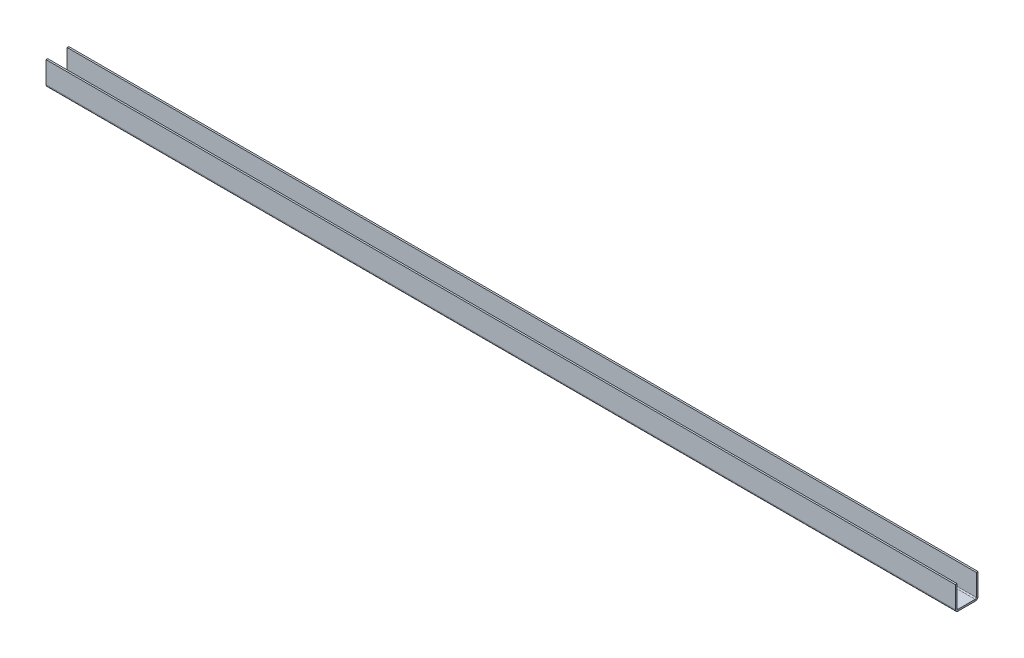
ISO-10303-21;
HEADER;
FILE_DESCRIPTION(('STEP AP214'),'2;1');
FILE_NAME('part.step','',(''),(''),'','','');
FILE_SCHEMA(('AUTOMOTIVE_DESIGN { 1 0 10303 214 1 1 1 1 }'));
ENDSEC;
DATA;
#1=APPLICATION_CONTEXT('core data for automotive mechanical design processes');
#2=APPLICATION_PROTOCOL_DEFINITION('international standard','automotive_design',2000,#1);
#3=PRODUCT_CONTEXT('',#1,'mechanical');
#4=PRODUCT('Part','Part','',(#3));
#5=PRODUCT_RELATED_PRODUCT_CATEGORY('part','',(#4));
#6=PRODUCT_DEFINITION_FORMATION('','',#4);
#7=PRODUCT_DEFINITION_CONTEXT('part definition',#1,'design');
#8=PRODUCT_DEFINITION('design','',#6,#7);
#9=PRODUCT_DEFINITION_SHAPE('','',#8);
#10=(LENGTH_UNIT() NAMED_UNIT(*) SI_UNIT(.MILLI.,.METRE.));
#11=(NAMED_UNIT(*) PLANE_ANGLE_UNIT() SI_UNIT($,.RADIAN.));
#12=(NAMED_UNIT(*) SI_UNIT($,.STERADIAN.) SOLID_ANGLE_UNIT());
#13=UNCERTAINTY_MEASURE_WITH_UNIT(LENGTH_MEASURE(1.E-05),#10,'distance_accuracy_value','');
#14=(GEOMETRIC_REPRESENTATION_CONTEXT(3) GLOBAL_UNCERTAINTY_ASSIGNED_CONTEXT((#13)) GLOBAL_UNIT_ASSIGNED_CONTEXT((#10,
#11,#12)) REPRESENTATION_CONTEXT('',''));
#15=CARTESIAN_POINT('',(0.,0.,0.));
#16=DIRECTION('',(0.,0.,1.));
#17=DIRECTION('',(1.,0.,0.));
#18=AXIS2_PLACEMENT_3D('',#15,#16,#17);
#19=CARTESIAN_POINT('',(400.,-1.50000000000006,2331.95118638464));
#20=DIRECTION('',(0.,1.,0.));
#21=DIRECTION('',(0.,0.,1.));
#22=AXIS2_PLACEMENT_3D('',#19,#20,#21);
#23=PLANE('',#22);
#24=DIRECTION('',(0.,0.,-1.));
#25=VECTOR('',#24,1.);
#26=CARTESIAN_POINT('',(400.,-1.50000000000006,2331.95118638464));
#27=LINE('',#26,#25);
#28=CARTESIAN_POINT('',(400.,-1.50000000000006,731.5));
#29=VERTEX_POINT('',#28);
#30=CARTESIAN_POINT('',(400.,-1.50000000000006,730.));
#31=VERTEX_POINT('',#30);
#32=EDGE_CURVE('E590',#29,#31,#27,.T.);
#33=ORIENTED_EDGE('',*,*,#32,.T.);
#34=DIRECTION('',(1.,0.,0.));
#35=VECTOR('',#34,1.);
#36=CARTESIAN_POINT('',(400.,-1.50000000000006,730.));
#37=LINE('',#36,#35);
#38=CARTESIAN_POINT('',(-400.,-1.50000000000006,730.));
#39=VERTEX_POINT('',#38);
#40=EDGE_CURVE('E592',#31,#39,#37,.F.);
#41=ORIENTED_EDGE('',*,*,#40,.T.);
#42=DIRECTION('',(0.,0.,-1.));
#43=VECTOR('',#42,1.);
#44=CARTESIAN_POINT('',(-400.,-1.50000000000006,2331.95118638464));
#45=LINE('',#44,#43);
#46=CARTESIAN_POINT('',(-400.,-1.50000000000006,731.5));
#47=VERTEX_POINT('',#46);
#48=EDGE_CURVE('E753',#47,#39,#45,.T.);
#49=ORIENTED_EDGE('',*,*,#48,.F.);
#50=DIRECTION('',(-1.,0.,0.));
#51=VECTOR('',#50,1.);
#52=CARTESIAN_POINT('',(400.,-1.50000000000006,731.5));
#53=LINE('',#52,#51);
#54=EDGE_CURVE('E125',#47,#29,#53,.F.);
#55=ORIENTED_EDGE('',*,*,#54,.T.);
#56=EDGE_LOOP('',(#33,#41,#49,#55));
#57=FACE_BOUND('',#56,.T.);
#58=ADVANCED_FACE('F69',(#57),#23,.T.);
#59=CARTESIAN_POINT('',(400.,-1.50000000000006,2331.95118638464));
#60=DIRECTION('',(1.,0.,0.));
#61=DIRECTION('',(0.,0.,1.));
#62=AXIS2_PLACEMENT_3D('',#59,#60,#61);
#63=PLANE('',#62);
#64=DIRECTION('',(0.,0.,-1.));
#65=VECTOR('',#64,1.);
#66=CARTESIAN_POINT('',(400.,-20.5,2331.95118638464));
#67=LINE('',#66,#65);
#68=CARTESIAN_POINT('',(400.,-20.5,731.5));
#69=VERTEX_POINT('',#68);
#70=CARTESIAN_POINT('',(400.,-20.4999999999998,730.));
#71=VERTEX_POINT('',#70);
#72=EDGE_CURVE('E636',#69,#71,#67,.T.);
#73=ORIENTED_EDGE('',*,*,#72,.T.);
#74=DIRECTION('',(0.,1.,0.));
#75=VECTOR('',#74,1.);
#76=CARTESIAN_POINT('',(400.,-19.,730.));
#77=LINE('',#76,#75);
#78=EDGE_CURVE('E756',#31,#71,#77,.F.);
#79=ORIENTED_EDGE('',*,*,#78,.F.);
#80=ORIENTED_EDGE('',*,*,#32,.F.);
#81=DIRECTION('',(0.,1.,0.));
#82=VECTOR('',#81,1.);
#83=CARTESIAN_POINT('',(400.,-1.50000000000006,731.5));
#84=LINE('',#83,#82);
#85=EDGE_CURVE('E119',#29,#69,#84,.F.);
#86=ORIENTED_EDGE('',*,*,#85,.T.);
#87=EDGE_LOOP('',(#73,#79,#80,#86));
#88=FACE_BOUND('',#87,.T.);
#89=ADVANCED_FACE('F736',(#88),#63,.T.);
#90=CARTESIAN_POINT('',(400.,-1.50000000000006,730.));
#91=DIRECTION('',(0.,0.,-1.));
#92=DIRECTION('',(-1.,0.,0.));
#93=AXIS2_PLACEMENT_3D('',#90,#91,#92);
#94=PLANE('',#93);
#95=ORIENTED_EDGE('',*,*,#78,.T.);
#96=DIRECTION('',(-1.,0.,0.));
#97=VECTOR('',#96,1.);
#98=CARTESIAN_POINT('',(400.,-20.5,730.));
#99=LINE('',#98,#97);
#100=CARTESIAN_POINT('',(-400.,-20.5000000000001,730.));
#101=VERTEX_POINT('',#100);
#102=EDGE_CURVE('E593',#101,#71,#99,.F.);
#103=ORIENTED_EDGE('',*,*,#102,.F.);
#104=DIRECTION('',(0.,1.,0.));
#105=VECTOR('',#104,1.);
#106=CARTESIAN_POINT('',(-400.,-20.,730.));
#107=LINE('',#106,#105);
#108=EDGE_CURVE('E388',#39,#101,#107,.F.);
#109=ORIENTED_EDGE('',*,*,#108,.F.);
#110=ORIENTED_EDGE('',*,*,#40,.F.);
#111=EDGE_LOOP('',(#95,#103,#109,#110));
#112=FACE_BOUND('',#111,.T.);
#113=ADVANCED_FACE('F741',(#112),#94,.T.);
#114=CARTESIAN_POINT('',(-400.,-1.50000000000006,2331.95118638464));
#115=DIRECTION('',(-1.,0.,0.));
#116=DIRECTION('',(0.,0.,-1.));
#117=AXIS2_PLACEMENT_3D('',#114,#115,#116);
#118=PLANE('',#117);
#119=ORIENTED_EDGE('',*,*,#48,.T.);
#120=ORIENTED_EDGE('',*,*,#108,.T.);
#121=DIRECTION('',(0.,0.,-1.));
#122=VECTOR('',#121,1.);
#123=CARTESIAN_POINT('',(-400.,-20.5,2331.95118638464));
#124=LINE('',#123,#122);
#125=CARTESIAN_POINT('',(-400.,-20.5,731.5));
#126=VERTEX_POINT('',#125);
#127=EDGE_CURVE('E74',#126,#101,#124,.T.);
#128=ORIENTED_EDGE('',*,*,#127,.F.);
#129=DIRECTION('',(0.,1.,0.));
#130=VECTOR('',#129,1.);
#131=CARTESIAN_POINT('',(-400.,-1.50000000000006,731.5));
#132=LINE('',#131,#130);
#133=EDGE_CURVE('E81',#126,#47,#132,.T.);
#134=ORIENTED_EDGE('',*,*,#133,.T.);
#135=EDGE_LOOP('',(#119,#120,#128,#134));
#136=FACE_BOUND('',#135,.T.);
#137=ADVANCED_FACE('F746',(#136),#118,.T.);
#138=CARTESIAN_POINT('',(400.,-1.50000000000006,731.5));
#139=DIRECTION('',(0.,0.,-1.));
#140=DIRECTION('',(-1.,0.,0.));
#141=AXIS2_PLACEMENT_3D('',#138,#139,#140);
#142=PLANE('',#141);
#143=DIRECTION('',(-1.,0.,0.));
#144=VECTOR('',#143,1.);
#145=CARTESIAN_POINT('',(400.,-20.5,731.5));
#146=LINE('',#145,#144);
#147=EDGE_CURVE('E13',#126,#69,#146,.F.);
#148=ORIENTED_EDGE('',*,*,#147,.T.);
#149=ORIENTED_EDGE('',*,*,#85,.F.);
#150=ORIENTED_EDGE('',*,*,#54,.F.);
#151=ORIENTED_EDGE('',*,*,#133,.F.);
#152=EDGE_LOOP('',(#148,#149,#150,#151));
#153=FACE_BOUND('',#152,.T.);
#154=ADVANCED_FACE('F72',(#153),#142,.F.);
#155=CARTESIAN_POINT('',(400.,-22.9999999999999,730.));
#156=DIRECTION('',(0.,-1.,0.));
#157=DIRECTION('',(0.,0.,-1.));
#158=AXIS2_PLACEMENT_3D('',#155,#156,#157);
#159=PLANE('',#158);
#160=DIRECTION('',(1.,0.,0.));
#161=VECTOR('',#160,1.);
#162=CARTESIAN_POINT('',(400.,-22.9999999999999,735.));
#163=LINE('',#162,#161);
#164=CARTESIAN_POINT('',(-2.7,-22.9999999999999,735.));
#165=VERTEX_POINT('',#164);
#166=CARTESIAN_POINT('',(2.7,-22.9999999999999,735.));
#167=VERTEX_POINT('',#166);
#168=EDGE_CURVE('E329',#165,#167,#163,.T.);
#169=ORIENTED_EDGE('',*,*,#168,.T.);
#170=DIRECTION('',(0.,0.,-1.));
#171=VECTOR('',#170,1.);
#172=CARTESIAN_POINT('',(2.69999999999998,-22.9999999999999,730.));
#173=LINE('',#172,#171);
#174=CARTESIAN_POINT('',(2.69999999999992,-22.9999999999998,732.5));
#175=VERTEX_POINT('',#174);
#176=EDGE_CURVE('E313',#167,#175,#173,.T.);
#177=ORIENTED_EDGE('',*,*,#176,.T.);
#178=DIRECTION('',(1.,0.,0.));
#179=VECTOR('',#178,1.);
#180=CARTESIAN_POINT('',(400.,-22.9999999999999,732.5));
#181=LINE('',#180,#179);
#182=CARTESIAN_POINT('',(400.,-22.9999999999999,732.5));
#183=VERTEX_POINT('',#182);
#184=EDGE_CURVE('E297',#175,#183,#181,.T.);
#185=ORIENTED_EDGE('',*,*,#184,.T.);
#186=DIRECTION('',(0.,0.,-1.));
#187=VECTOR('',#186,1.);
#188=CARTESIAN_POINT('',(400.,-22.9999999999999,731.5));
#189=LINE('',#188,#187);
#190=CARTESIAN_POINT('',(400.,-22.9999999999999,747.5));
#191=VERTEX_POINT('',#190);
#192=EDGE_CURVE('E312',#191,#183,#189,.T.);
#193=ORIENTED_EDGE('',*,*,#192,.F.);
#194=DIRECTION('',(-1.,0.,0.));
#195=VECTOR('',#194,1.);
#196=CARTESIAN_POINT('',(400.,-22.9999999999999,747.5));
#197=LINE('',#196,#195);
#198=CARTESIAN_POINT('',(2.69999999999998,-22.9999999999999,747.5));
#199=VERTEX_POINT('',#198);
#200=EDGE_CURVE('E588',#199,#191,#197,.F.);
#201=ORIENTED_EDGE('',*,*,#200,.F.);
#202=DIRECTION('',(0.,0.,-1.));
#203=VECTOR('',#202,1.);
#204=CARTESIAN_POINT('',(2.69999999999998,-22.9999999999999,730.));
#205=LINE('',#204,#203);
#206=CARTESIAN_POINT('',(2.7,-22.9999999999999,745.));
#207=VERTEX_POINT('',#206);
#208=EDGE_CURVE('E649',#199,#207,#205,.T.);
#209=ORIENTED_EDGE('',*,*,#208,.T.);
#210=DIRECTION('',(-1.,0.,0.));
#211=VECTOR('',#210,1.);
#212=CARTESIAN_POINT('',(400.,-22.9999999999999,745.));
#213=LINE('',#212,#211);
#214=CARTESIAN_POINT('',(-2.7,-22.9999999999999,745.));
#215=VERTEX_POINT('',#214);
#216=EDGE_CURVE('E652',#207,#215,#213,.T.);
#217=ORIENTED_EDGE('',*,*,#216,.T.);
#218=DIRECTION('',(0.,0.,1.));
#219=VECTOR('',#218,1.);
#220=CARTESIAN_POINT('',(-2.69999999999998,-22.9999999999999,730.));
#221=LINE('',#220,#219);
#222=CARTESIAN_POINT('',(-2.69999999999992,-22.9999999999999,747.5));
#223=VERTEX_POINT('',#222);
#224=EDGE_CURVE('E657',#215,#223,#221,.T.);
#225=ORIENTED_EDGE('',*,*,#224,.T.);
#226=CARTESIAN_POINT('',(-400.,-22.9999999999999,747.5));
#227=VERTEX_POINT('',#226);
#228=EDGE_CURVE('E650',#227,#223,#197,.F.);
#229=ORIENTED_EDGE('',*,*,#228,.F.);
#230=DIRECTION('',(0.,0.,1.));
#231=VECTOR('',#230,1.);
#232=CARTESIAN_POINT('',(-400.,-22.9999999999999,748.5));
#233=LINE('',#232,#231);
#234=CARTESIAN_POINT('',(-400.,-22.9999999999999,732.5));
#235=VERTEX_POINT('',#234);
#236=EDGE_CURVE('E656',#235,#227,#233,.T.);
#237=ORIENTED_EDGE('',*,*,#236,.F.);
#238=CARTESIAN_POINT('',(-2.69999999999992,-22.9999999999998,732.5));
#239=VERTEX_POINT('',#238);
#240=EDGE_CURVE('E315',#235,#239,#181,.T.);
#241=ORIENTED_EDGE('',*,*,#240,.T.);
#242=DIRECTION('',(0.,0.,1.));
#243=VECTOR('',#242,1.);
#244=CARTESIAN_POINT('',(-2.69999999999998,-22.9999999999999,730.));
#245=LINE('',#244,#243);
#246=EDGE_CURVE('E680',#239,#165,#245,.T.);
#247=ORIENTED_EDGE('',*,*,#246,.T.);
#248=EDGE_LOOP('',(#169,#177,#185,#193,#201,#209,#217,#225,#229,#237,#241,#247));
#249=FACE_BOUND('',#248,.T.);
#250=ADVANCED_FACE('F327',(#249),#159,.T.);
#251=CARTESIAN_POINT('',(2.69999999999998,1578.78122528511,730.));
#252=DIRECTION('',(-1.,0.,0.));
#253=DIRECTION('',(0.,-1.,0.));
#254=AXIS2_PLACEMENT_3D('',#251,#252,#253);
#255=PLANE('',#254);
#256=DIRECTION('',(0.,-1.,0.));
#257=VECTOR('',#256,1.);
#258=CARTESIAN_POINT('',(2.69999999999998,1578.78122528511,732.5));
#259=LINE('',#258,#257);
#260=CARTESIAN_POINT('',(2.69999999999992,-21.4999999999999,732.5));
#261=VERTEX_POINT('',#260);
#262=EDGE_CURVE('E320',#261,#175,#259,.T.);
#263=ORIENTED_EDGE('',*,*,#262,.T.);
#264=ORIENTED_EDGE('',*,*,#176,.F.);
#265=DIRECTION('',(0.,-1.,0.));
#266=VECTOR('',#265,1.);
#267=CARTESIAN_POINT('',(2.7,1578.78122528511,735.));
#268=LINE('',#267,#266);
#269=CARTESIAN_POINT('',(2.7,-21.4999999999999,735.));
#270=VERTEX_POINT('',#269);
#271=EDGE_CURVE('E382',#270,#167,#268,.T.);
#272=ORIENTED_EDGE('',*,*,#271,.F.);
#273=DIRECTION('',(0.,0.,-1.));
#274=VECTOR('',#273,1.);
#275=CARTESIAN_POINT('',(2.69999999999998,-21.5,730.));
#276=LINE('',#275,#274);
#277=EDGE_CURVE('E336',#270,#261,#276,.T.);
#278=ORIENTED_EDGE('',*,*,#277,.T.);
#279=EDGE_LOOP('',(#263,#264,#272,#278));
#280=FACE_BOUND('',#279,.T.);
#281=ADVANCED_FACE('F334',(#280),#255,.T.);
#282=CARTESIAN_POINT('',(400.,1578.78122528511,735.));
#283=DIRECTION('',(0.,0.,-1.));
#284=DIRECTION('',(0.,1.,0.));
#285=AXIS2_PLACEMENT_3D('',#282,#283,#284);
#286=PLANE('',#285);
#287=ORIENTED_EDGE('',*,*,#271,.T.);
#288=ORIENTED_EDGE('',*,*,#168,.F.);
#289=DIRECTION('',(0.,-1.,0.));
#290=VECTOR('',#289,1.);
#291=CARTESIAN_POINT('',(-2.7,1578.78122528511,735.));
#292=LINE('',#291,#290);
#293=CARTESIAN_POINT('',(-2.7,-21.4999999999999,735.));
#294=VERTEX_POINT('',#293);
#295=EDGE_CURVE('E379',#294,#165,#292,.T.);
#296=ORIENTED_EDGE('',*,*,#295,.F.);
#297=DIRECTION('',(1.,0.,0.));
#298=VECTOR('',#297,1.);
#299=CARTESIAN_POINT('',(400.,-21.5,735.));
#300=LINE('',#299,#298);
#301=EDGE_CURVE('E135',#294,#270,#300,.T.);
#302=ORIENTED_EDGE('',*,*,#301,.T.);
#303=EDGE_LOOP('',(#287,#288,#296,#302));
#304=FACE_BOUND('',#303,.T.);
#305=ADVANCED_FACE('F726',(#304),#286,.T.);
#306=CARTESIAN_POINT('',(-2.69999999999998,1578.78122528511,730.));
#307=DIRECTION('',(1.,0.,0.));
#308=DIRECTION('',(0.,1.,0.));
#309=AXIS2_PLACEMENT_3D('',#306,#307,#308);
#310=PLANE('',#309);
#311=ORIENTED_EDGE('',*,*,#295,.T.);
#312=ORIENTED_EDGE('',*,*,#246,.F.);
#313=DIRECTION('',(0.,-1.,0.));
#314=VECTOR('',#313,1.);
#315=CARTESIAN_POINT('',(-2.69999999999998,1578.78122528511,732.5));
#316=LINE('',#315,#314);
#317=CARTESIAN_POINT('',(-2.69999999999992,-21.4999999999999,732.5));
#318=VERTEX_POINT('',#317);
#319=EDGE_CURVE('E376',#318,#239,#316,.T.);
#320=ORIENTED_EDGE('',*,*,#319,.F.);
#321=DIRECTION('',(0.,0.,1.));
#322=VECTOR('',#321,1.);
#323=CARTESIAN_POINT('',(-2.69999999999998,-21.5,730.));
#324=LINE('',#323,#322);
#325=EDGE_CURVE('E144',#318,#294,#324,.T.);
#326=ORIENTED_EDGE('',*,*,#325,.T.);
#327=EDGE_LOOP('',(#311,#312,#320,#326));
#328=FACE_BOUND('',#327,.T.);
#329=ADVANCED_FACE('F725',(#328),#310,.T.);
#330=CARTESIAN_POINT('',(-400.,1578.78122528511,730.));
#331=DIRECTION('',(-1.,0.,0.));
#332=DIRECTION('',(0.,-1.,0.));
#333=AXIS2_PLACEMENT_3D('',#330,#331,#332);
#334=PLANE('',#333);
#335=DIRECTION('',(0.,-1.,0.));
#336=VECTOR('',#335,1.);
#337=CARTESIAN_POINT('',(-400.,1578.78122528511,732.5));
#338=LINE('',#337,#336);
#339=CARTESIAN_POINT('',(-400.,-21.4999999999999,732.5));
#340=VERTEX_POINT('',#339);
#341=EDGE_CURVE('E372',#340,#235,#338,.T.);
#342=ORIENTED_EDGE('',*,*,#341,.T.);
#343=ORIENTED_EDGE('',*,*,#236,.T.);
#344=DIRECTION('',(0.,-1.,0.));
#345=VECTOR('',#344,1.);
#346=CARTESIAN_POINT('',(-400.,1578.78122528511,747.5));
#347=LINE('',#346,#345);
#348=CARTESIAN_POINT('',(-400.,-21.5,747.5));
#349=VERTEX_POINT('',#348);
#350=EDGE_CURVE('E368',#349,#227,#347,.T.);
#351=ORIENTED_EDGE('',*,*,#350,.F.);
#352=DIRECTION('',(0.,0.,-1.));
#353=VECTOR('',#352,1.);
#354=CARTESIAN_POINT('',(-400.,-21.5,730.));
#355=LINE('',#354,#353);
#356=EDGE_CURVE('E448',#349,#340,#355,.T.);
#357=ORIENTED_EDGE('',*,*,#356,.T.);
#358=EDGE_LOOP('',(#342,#343,#351,#357));
#359=FACE_BOUND('',#358,.T.);
#360=ADVANCED_FACE('F714',(#359),#334,.T.);
#361=CARTESIAN_POINT('',(-2.69999999999998,1578.78122528511,730.));
#362=DIRECTION('',(1.,0.,0.));
#363=DIRECTION('',(0.,1.,0.));
#364=AXIS2_PLACEMENT_3D('',#361,#362,#363);
#365=PLANE('',#364);
#366=DIRECTION('',(0.,-1.,0.));
#367=VECTOR('',#366,1.);
#368=CARTESIAN_POINT('',(-2.69999999999998,1578.78122528511,747.5));
#369=LINE('',#368,#367);
#370=CARTESIAN_POINT('',(-2.69999999999998,-21.4999999999999,747.5));
#371=VERTEX_POINT('',#370);
#372=EDGE_CURVE('E365',#371,#223,#369,.T.);
#373=ORIENTED_EDGE('',*,*,#372,.T.);
#374=ORIENTED_EDGE('',*,*,#224,.F.);
#375=DIRECTION('',(0.,-1.,0.));
#376=VECTOR('',#375,1.);
#377=CARTESIAN_POINT('',(-2.7,1578.78122528511,745.));
#378=LINE('',#377,#376);
#379=CARTESIAN_POINT('',(-2.7,-21.4999999999999,745.));
#380=VERTEX_POINT('',#379);
#381=EDGE_CURVE('E361',#380,#215,#378,.T.);
#382=ORIENTED_EDGE('',*,*,#381,.F.);
#383=DIRECTION('',(0.,0.,1.));
#384=VECTOR('',#383,1.);
#385=CARTESIAN_POINT('',(-2.69999999999998,-21.5,730.));
#386=LINE('',#385,#384);
#387=EDGE_CURVE('E692',#380,#371,#386,.T.);
#388=ORIENTED_EDGE('',*,*,#387,.T.);
#389=EDGE_LOOP('',(#373,#374,#382,#388));
#390=FACE_BOUND('',#389,.T.);
#391=ADVANCED_FACE('F792',(#390),#365,.T.);
#392=CARTESIAN_POINT('',(400.,1578.78122528511,745.));
#393=DIRECTION('',(0.,0.,1.));
#394=DIRECTION('',(0.,-1.,0.));
#395=AXIS2_PLACEMENT_3D('',#392,#393,#394);
#396=PLANE('',#395);
#397=ORIENTED_EDGE('',*,*,#381,.T.);
#398=ORIENTED_EDGE('',*,*,#216,.F.);
#399=DIRECTION('',(0.,-1.,0.));
#400=VECTOR('',#399,1.);
#401=CARTESIAN_POINT('',(2.7,1578.78122528511,745.));
#402=LINE('',#401,#400);
#403=CARTESIAN_POINT('',(2.7,-21.4999999999999,745.));
#404=VERTEX_POINT('',#403);
#405=EDGE_CURVE('E357',#404,#207,#402,.T.);
#406=ORIENTED_EDGE('',*,*,#405,.F.);
#407=DIRECTION('',(-1.,0.,0.));
#408=VECTOR('',#407,1.);
#409=CARTESIAN_POINT('',(400.,-21.5,745.));
#410=LINE('',#409,#408);
#411=EDGE_CURVE('E695',#404,#380,#410,.T.);
#412=ORIENTED_EDGE('',*,*,#411,.T.);
#413=EDGE_LOOP('',(#397,#398,#406,#412));
#414=FACE_BOUND('',#413,.T.);
#415=ADVANCED_FACE('F789',(#414),#396,.T.);
#416=CARTESIAN_POINT('',(2.69999999999998,1578.78122528511,730.));
#417=DIRECTION('',(-1.,0.,0.));
#418=DIRECTION('',(0.,-1.,0.));
#419=AXIS2_PLACEMENT_3D('',#416,#417,#418);
#420=PLANE('',#419);
#421=ORIENTED_EDGE('',*,*,#405,.T.);
#422=ORIENTED_EDGE('',*,*,#208,.F.);
#423=DIRECTION('',(0.,-1.,0.));
#424=VECTOR('',#423,1.);
#425=CARTESIAN_POINT('',(2.69999999999998,1578.78122528511,747.5));
#426=LINE('',#425,#424);
#427=CARTESIAN_POINT('',(2.69999999999998,-21.5,747.5));
#428=VERTEX_POINT('',#427);
#429=EDGE_CURVE('E353',#428,#199,#426,.T.);
#430=ORIENTED_EDGE('',*,*,#429,.F.);
#431=DIRECTION('',(0.,0.,-1.));
#432=VECTOR('',#431,1.);
#433=CARTESIAN_POINT('',(2.69999999999998,-21.5,730.));
#434=LINE('',#433,#432);
#435=EDGE_CURVE('E699',#428,#404,#434,.T.);
#436=ORIENTED_EDGE('',*,*,#435,.T.);
#437=EDGE_LOOP('',(#421,#422,#430,#436));
#438=FACE_BOUND('',#437,.T.);
#439=ADVANCED_FACE('F786',(#438),#420,.T.);
#440=CARTESIAN_POINT('',(400.,1578.78122528511,730.));
#441=DIRECTION('',(1.,0.,0.));
#442=DIRECTION('',(0.,1.,0.));
#443=AXIS2_PLACEMENT_3D('',#440,#441,#442);
#444=PLANE('',#443);
#445=DIRECTION('',(0.,-1.,0.));
#446=VECTOR('',#445,1.);
#447=CARTESIAN_POINT('',(400.,1578.78122528511,747.5));
#448=LINE('',#447,#446);
#449=CARTESIAN_POINT('',(400.,-21.4999999999999,747.5));
#450=VERTEX_POINT('',#449);
#451=EDGE_CURVE('E344',#450,#191,#448,.T.);
#452=ORIENTED_EDGE('',*,*,#451,.T.);
#453=ORIENTED_EDGE('',*,*,#192,.T.);
#454=DIRECTION('',(0.,-1.,0.));
#455=VECTOR('',#454,1.);
#456=CARTESIAN_POINT('',(400.,1578.78122528511,732.5));
#457=LINE('',#456,#455);
#458=CARTESIAN_POINT('',(400.,-21.4999999999999,732.5));
#459=VERTEX_POINT('',#458);
#460=EDGE_CURVE('E339',#459,#183,#457,.T.);
#461=ORIENTED_EDGE('',*,*,#460,.F.);
#462=DIRECTION('',(0.,0.,-1.));
#463=VECTOR('',#462,1.);
#464=CARTESIAN_POINT('',(400.,-21.5,730.));
#465=LINE('',#464,#463);
#466=EDGE_CURVE('E346',#459,#450,#465,.F.);
#467=ORIENTED_EDGE('',*,*,#466,.T.);
#468=EDGE_LOOP('',(#452,#453,#461,#467));
#469=FACE_BOUND('',#468,.T.);
#470=ADVANCED_FACE('F646',(#469),#444,.T.);
#471=CARTESIAN_POINT('',(400.,-21.5,730.));
#472=DIRECTION('',(0.,-1.,0.));
#473=DIRECTION('',(0.,0.,-1.));
#474=AXIS2_PLACEMENT_3D('',#471,#472,#473);
#475=PLANE('',#474);
#476=ORIENTED_EDGE('',*,*,#277,.F.);
#477=ORIENTED_EDGE('',*,*,#301,.F.);
#478=ORIENTED_EDGE('',*,*,#325,.F.);
#479=DIRECTION('',(1.,0.,0.));
#480=VECTOR('',#479,1.);
#481=CARTESIAN_POINT('',(400.,-21.5,732.5));
#482=LINE('',#481,#480);
#483=EDGE_CURVE('E348',#340,#318,#482,.T.);
#484=ORIENTED_EDGE('',*,*,#483,.F.);
#485=ORIENTED_EDGE('',*,*,#356,.F.);
#486=DIRECTION('',(-1.,0.,0.));
#487=VECTOR('',#486,1.);
#488=CARTESIAN_POINT('',(400.,-21.5,747.5));
#489=LINE('',#488,#487);
#490=EDGE_CURVE('E696',#349,#371,#489,.F.);
#491=ORIENTED_EDGE('',*,*,#490,.T.);
#492=ORIENTED_EDGE('',*,*,#387,.F.);
#493=ORIENTED_EDGE('',*,*,#411,.F.);
#494=ORIENTED_EDGE('',*,*,#435,.F.);
#495=EDGE_CURVE('E643',#428,#450,#489,.F.);
#496=ORIENTED_EDGE('',*,*,#495,.T.);
#497=ORIENTED_EDGE('',*,*,#466,.F.);
#498=EDGE_CURVE('E340',#261,#459,#482,.T.);
#499=ORIENTED_EDGE('',*,*,#498,.F.);
#500=EDGE_LOOP('',(#476,#477,#478,#484,#485,#491,#492,#493,#494,#496,#497,#499));
#501=FACE_BOUND('',#500,.T.);
#502=ADVANCED_FACE('F641',(#501),#475,.F.);
#503=CARTESIAN_POINT('',(400.,-1.49999999999993,-851.951186384639));
#504=DIRECTION('',(0.,1.,0.));
#505=DIRECTION('',(0.,0.,1.));
#506=AXIS2_PLACEMENT_3D('',#503,#504,#505);
#507=PLANE('',#506);
#508=DIRECTION('',(0.,0.,1.));
#509=VECTOR('',#508,1.);
#510=CARTESIAN_POINT('',(-400.,-1.49999999999993,-851.951186384639));
#511=LINE('',#510,#509);
#512=CARTESIAN_POINT('',(-400.,-1.49999999999993,748.5));
#513=VERTEX_POINT('',#512);
#514=CARTESIAN_POINT('',(-400.,-1.49999999999993,750.));
#515=VERTEX_POINT('',#514);
#516=EDGE_CURVE('E541',#513,#515,#511,.T.);
#517=ORIENTED_EDGE('',*,*,#516,.T.);
#518=DIRECTION('',(1.,0.,0.));
#519=VECTOR('',#518,1.);
#520=CARTESIAN_POINT('',(400.,-1.49999999999993,750.));
#521=LINE('',#520,#519);
#522=CARTESIAN_POINT('',(400.,-1.49999999999993,750.));
#523=VERTEX_POINT('',#522);
#524=EDGE_CURVE('E535',#515,#523,#521,.T.);
#525=ORIENTED_EDGE('',*,*,#524,.T.);
#526=DIRECTION('',(0.,0.,1.));
#527=VECTOR('',#526,1.);
#528=CARTESIAN_POINT('',(400.,-1.49999999999993,-851.951186384639));
#529=LINE('',#528,#527);
#530=CARTESIAN_POINT('',(400.,-1.49999999999993,748.5));
#531=VERTEX_POINT('',#530);
#532=EDGE_CURVE('E515',#531,#523,#529,.T.);
#533=ORIENTED_EDGE('',*,*,#532,.F.);
#534=DIRECTION('',(1.,0.,0.));
#535=VECTOR('',#534,1.);
#536=CARTESIAN_POINT('',(400.,-1.49999999999993,748.5));
#537=LINE('',#536,#535);
#538=EDGE_CURVE('E540',#531,#513,#537,.F.);
#539=ORIENTED_EDGE('',*,*,#538,.T.);
#540=EDGE_LOOP('',(#517,#525,#533,#539));
#541=FACE_BOUND('',#540,.T.);
#542=ADVANCED_FACE('F576',(#541),#507,.T.);
#543=CARTESIAN_POINT('',(400.,-21.4999999999999,748.5));
#544=DIRECTION('',(0.,0.,1.));
#545=DIRECTION('',(1.,0.,0.));
#546=AXIS2_PLACEMENT_3D('',#543,#544,#545);
#547=PLANE('',#546);
#548=ORIENTED_EDGE('',*,*,#538,.F.);
#549=DIRECTION('',(0.,1.,0.));
#550=VECTOR('',#549,1.);
#551=CARTESIAN_POINT('',(400.,-21.4999999999999,748.5));
#552=LINE('',#551,#550);
#553=CARTESIAN_POINT('',(400.,-20.4999999999999,748.5));
#554=VERTEX_POINT('',#553);
#555=EDGE_CURVE('E401',#554,#531,#552,.T.);
#556=ORIENTED_EDGE('',*,*,#555,.F.);
#557=DIRECTION('',(1.,0.,0.));
#558=VECTOR('',#557,1.);
#559=CARTESIAN_POINT('',(400.,-20.4999999999999,748.5));
#560=LINE('',#559,#558);
#561=CARTESIAN_POINT('',(-400.,-20.4999999999999,748.5));
#562=VERTEX_POINT('',#561);
#563=EDGE_CURVE('E402',#562,#554,#560,.T.);
#564=ORIENTED_EDGE('',*,*,#563,.F.);
#565=DIRECTION('',(0.,1.,0.));
#566=VECTOR('',#565,1.);
#567=CARTESIAN_POINT('',(-400.,-21.4999999999999,748.5));
#568=LINE('',#567,#566);
#569=EDGE_CURVE('E523',#513,#562,#568,.F.);
#570=ORIENTED_EDGE('',*,*,#569,.F.);
#571=EDGE_LOOP('',(#548,#556,#564,#570));
#572=FACE_BOUND('',#571,.T.);
#573=ADVANCED_FACE('F565',(#572),#547,.F.);
#574=CARTESIAN_POINT('',(-400.,-21.4999999999999,-851.951186384639));
#575=DIRECTION('',(-1.,0.,0.));
#576=DIRECTION('',(0.,0.,1.));
#577=AXIS2_PLACEMENT_3D('',#574,#575,#576);
#578=PLANE('',#577);
#579=DIRECTION('',(0.,0.,1.));
#580=VECTOR('',#579,1.);
#581=CARTESIAN_POINT('',(-400.,-20.4999999999999,-851.951186384639));
#582=LINE('',#581,#580);
#583=CARTESIAN_POINT('',(-400.,-20.4999999999999,750.));
#584=VERTEX_POINT('',#583);
#585=EDGE_CURVE('E532',#562,#584,#582,.T.);
#586=ORIENTED_EDGE('',*,*,#585,.T.);
#587=DIRECTION('',(0.,1.,0.));
#588=VECTOR('',#587,1.);
#589=CARTESIAN_POINT('',(-400.,-18.9999999999999,750.));
#590=LINE('',#589,#588);
#591=EDGE_CURVE('E527',#584,#515,#590,.T.);
#592=ORIENTED_EDGE('',*,*,#591,.T.);
#593=ORIENTED_EDGE('',*,*,#516,.F.);
#594=ORIENTED_EDGE('',*,*,#569,.T.);
#595=EDGE_LOOP('',(#586,#592,#593,#594));
#596=FACE_BOUND('',#595,.T.);
#597=ADVANCED_FACE('F579',(#596),#578,.T.);
#598=CARTESIAN_POINT('',(400.,-21.4999999999999,750.));
#599=DIRECTION('',(0.,0.,1.));
#600=DIRECTION('',(1.,0.,0.));
#601=AXIS2_PLACEMENT_3D('',#598,#599,#600);
#602=PLANE('',#601);
#603=DIRECTION('',(0.,1.,0.));
#604=VECTOR('',#603,1.);
#605=CARTESIAN_POINT('',(400.,-19.9999999999999,750.));
#606=LINE('',#605,#604);
#607=CARTESIAN_POINT('',(400.,-20.4999999999999,750.));
#608=VERTEX_POINT('',#607);
#609=EDGE_CURVE('E511',#523,#608,#606,.F.);
#610=ORIENTED_EDGE('',*,*,#609,.F.);
#611=ORIENTED_EDGE('',*,*,#524,.F.);
#612=ORIENTED_EDGE('',*,*,#591,.F.);
#613=DIRECTION('',(1.,0.,0.));
#614=VECTOR('',#613,1.);
#615=CARTESIAN_POINT('',(400.,-20.4999999999999,750.));
#616=LINE('',#615,#614);
#617=EDGE_CURVE('E518',#584,#608,#616,.T.);
#618=ORIENTED_EDGE('',*,*,#617,.T.);
#619=EDGE_LOOP('',(#610,#611,#612,#618));
#620=FACE_BOUND('',#619,.T.);
#621=ADVANCED_FACE('F572',(#620),#602,.T.);
#622=CARTESIAN_POINT('',(400.,-21.4999999999999,-851.951186384639));
#623=DIRECTION('',(1.,0.,0.));
#624=DIRECTION('',(0.,0.,-1.));
#625=AXIS2_PLACEMENT_3D('',#622,#623,#624);
#626=PLANE('',#625);
#627=ORIENTED_EDGE('',*,*,#532,.T.);
#628=ORIENTED_EDGE('',*,*,#609,.T.);
#629=DIRECTION('',(0.,0.,1.));
#630=VECTOR('',#629,1.);
#631=CARTESIAN_POINT('',(400.,-20.4999999999999,-851.951186384639));
#632=LINE('',#631,#630);
#633=EDGE_CURVE('E544',#554,#608,#632,.T.);
#634=ORIENTED_EDGE('',*,*,#633,.F.);
#635=ORIENTED_EDGE('',*,*,#555,.T.);
#636=EDGE_LOOP('',(#627,#628,#634,#635));
#637=FACE_BOUND('',#636,.T.);
#638=ADVANCED_FACE('F569',(#637),#626,.T.);
#639=CARTESIAN_POINT('',(2.69999999999992,-20.4999999999999,747.5));
#640=DIRECTION('',(-1.,0.,0.));
#641=DIRECTION('',(0.,0.,1.));
#642=AXIS2_PLACEMENT_3D('',#639,#640,#641);
#643=PLANE('',#642);
#644=DIRECTION('',(0.,-0.799999999999885,0.600000000000154));
#645=VECTOR('',#644,1.);
#646=CARTESIAN_POINT('',(2.69999999999992,-21.6713803811561,748.378535285868));
#647=LINE('',#646,#645);
#648=CARTESIAN_POINT('',(2.69999999999992,-21.2999999999998,748.1));
#649=VERTEX_POINT('',#648);
#650=CARTESIAN_POINT('',(2.69999999999992,-22.4999999999996,749.));
#651=VERTEX_POINT('',#650);
#652=EDGE_CURVE('E502',#649,#651,#647,.T.);
#653=ORIENTED_EDGE('',*,*,#652,.F.);
#654=CARTESIAN_POINT('',(2.69999999999992,-20.4999999999999,747.5));
#655=DIRECTION('',(-1.,0.,0.));
#656=DIRECTION('',(0.,0.,1.));
#657=AXIS2_PLACEMENT_3D('',#654,#655,#656);
#658=CIRCLE('',#657,0.999999999999996);
#659=EDGE_CURVE('E438',#649,#428,#658,.F.);
#660=ORIENTED_EDGE('',*,*,#659,.T.);
#661=ORIENTED_EDGE('',*,*,#429,.T.);
#662=CARTESIAN_POINT('',(2.69999999999992,-20.4999999999999,747.5));
#663=DIRECTION('',(-1.,0.,0.));
#664=DIRECTION('',(0.,0.,1.));
#665=AXIS2_PLACEMENT_3D('',#662,#663,#664);
#666=CIRCLE('',#665,2.49999999999994);
#667=EDGE_CURVE('E491',#651,#199,#666,.F.);
#668=ORIENTED_EDGE('',*,*,#667,.F.);
#669=EDGE_LOOP('',(#653,#660,#661,#668));
#670=FACE_BOUND('',#669,.T.);
#671=ADVANCED_FACE('F849',(#670),#643,.T.);
#672=CARTESIAN_POINT('',(400.,-20.4999999999999,747.5));
#673=DIRECTION('',(1.,0.,0.));
#674=DIRECTION('',(0.,0.,-1.));
#675=AXIS2_PLACEMENT_3D('',#672,#673,#674);
#676=PLANE('',#675);
#677=ORIENTED_EDGE('',*,*,#451,.F.);
#678=CARTESIAN_POINT('',(400.,-20.4999999999999,747.5));
#679=DIRECTION('',(-1.,0.,0.));
#680=DIRECTION('',(0.,0.,1.));
#681=AXIS2_PLACEMENT_3D('',#678,#679,#680);
#682=CIRCLE('',#681,0.999999999999996);
#683=EDGE_CURVE('E433',#450,#554,#682,.T.);
#684=ORIENTED_EDGE('',*,*,#683,.T.);
#685=ORIENTED_EDGE('',*,*,#633,.T.);
#686=CARTESIAN_POINT('',(400.,-20.4999999999999,747.5));
#687=DIRECTION('',(-1.,0.,0.));
#688=DIRECTION('',(0.,0.,1.));
#689=AXIS2_PLACEMENT_3D('',#686,#687,#688);
#690=CIRCLE('',#689,2.49999999999994);
#691=EDGE_CURVE('E487',#191,#608,#690,.T.);
#692=ORIENTED_EDGE('',*,*,#691,.F.);
#693=EDGE_LOOP('',(#677,#684,#685,#692));
#694=FACE_BOUND('',#693,.T.);
#695=ADVANCED_FACE('F563',(#694),#676,.T.);
#696=CARTESIAN_POINT('',(-400.,-20.4999999999999,747.5));
#697=DIRECTION('',(-1.,0.,0.));
#698=DIRECTION('',(0.,0.,1.));
#699=AXIS2_PLACEMENT_3D('',#696,#697,#698);
#700=PLANE('',#699);
#701=ORIENTED_EDGE('',*,*,#585,.F.);
#702=CARTESIAN_POINT('',(-400.,-20.4999999999999,747.5));
#703=DIRECTION('',(-1.,0.,0.));
#704=DIRECTION('',(0.,0.,1.));
#705=AXIS2_PLACEMENT_3D('',#702,#703,#704);
#706=CIRCLE('',#705,0.999999999999996);
#707=EDGE_CURVE('E426',#562,#349,#706,.F.);
#708=ORIENTED_EDGE('',*,*,#707,.T.);
#709=ORIENTED_EDGE('',*,*,#350,.T.);
#710=CARTESIAN_POINT('',(-400.,-20.4999999999999,747.5));
#711=DIRECTION('',(-1.,0.,0.));
#712=DIRECTION('',(0.,0.,1.));
#713=AXIS2_PLACEMENT_3D('',#710,#711,#712);
#714=CIRCLE('',#713,2.49999999999994);
#715=EDGE_CURVE('E479',#584,#227,#714,.F.);
#716=ORIENTED_EDGE('',*,*,#715,.F.);
#717=EDGE_LOOP('',(#701,#708,#709,#716));
#718=FACE_BOUND('',#717,.T.);
#719=ADVANCED_FACE('F862',(#718),#700,.T.);
#720=CARTESIAN_POINT('',(-2.69999999999992,-20.4999999999999,747.5));
#721=DIRECTION('',(1.,0.,0.));
#722=DIRECTION('',(0.,1.,0.));
#723=AXIS2_PLACEMENT_3D('',#720,#721,#722);
#724=PLANE('',#723);
#725=ORIENTED_EDGE('',*,*,#372,.F.);
#726=CARTESIAN_POINT('',(-2.69999999999992,-20.4999999999999,747.5));
#727=DIRECTION('',(-1.,0.,0.));
#728=DIRECTION('',(0.,0.,1.));
#729=AXIS2_PLACEMENT_3D('',#726,#727,#728);
#730=CIRCLE('',#729,0.999999999999996);
#731=CARTESIAN_POINT('',(-2.69999999999992,-21.2999999999998,748.1));
#732=VERTEX_POINT('',#731);
#733=EDGE_CURVE('E420',#371,#732,#730,.T.);
#734=ORIENTED_EDGE('',*,*,#733,.T.);
#735=DIRECTION('',(0.,-0.799999999999885,0.600000000000154));
#736=VECTOR('',#735,1.);
#737=CARTESIAN_POINT('',(-2.69999999999986,-21.6713803811561,748.378535285868));
#738=LINE('',#737,#736);
#739=CARTESIAN_POINT('',(-2.69999999999992,-22.4999999999996,749.));
#740=VERTEX_POINT('',#739);
#741=EDGE_CURVE('E499',#732,#740,#738,.T.);
#742=ORIENTED_EDGE('',*,*,#741,.T.);
#743=CARTESIAN_POINT('',(-2.69999999999992,-20.4999999999999,747.5));
#744=DIRECTION('',(-1.,0.,0.));
#745=DIRECTION('',(0.,0.,1.));
#746=AXIS2_PLACEMENT_3D('',#743,#744,#745);
#747=CIRCLE('',#746,2.49999999999994);
#748=EDGE_CURVE('E474',#223,#740,#747,.T.);
#749=ORIENTED_EDGE('',*,*,#748,.F.);
#750=EDGE_LOOP('',(#725,#734,#742,#749));
#751=FACE_BOUND('',#750,.T.);
#752=ADVANCED_FACE('F868',(#751),#724,.T.);
#753=CARTESIAN_POINT('',(0.,-21.6713803811561,748.378535285868));
#754=DIRECTION('',(0.,-0.600000000000148,-0.799999999999889));
#755=DIRECTION('',(1.,0.,0.));
#756=AXIS2_PLACEMENT_3D('',#753,#754,#755);
#757=PLANE('',#756);
#758=DIRECTION('',(-1.,0.,0.));
#759=VECTOR('',#758,1.);
#760=CARTESIAN_POINT('',(1000.7223221755,-21.2999999999998,748.1));
#761=LINE('',#760,#759);
#762=EDGE_CURVE('E480',#732,#649,#761,.F.);
#763=ORIENTED_EDGE('',*,*,#762,.T.);
#764=ORIENTED_EDGE('',*,*,#652,.T.);
#765=DIRECTION('',(-1.,0.,0.));
#766=VECTOR('',#765,1.);
#767=CARTESIAN_POINT('',(1000.7223221755,-22.4999999999996,749.));
#768=LINE('',#767,#766);
#769=EDGE_CURVE('E428',#740,#651,#768,.F.);
#770=ORIENTED_EDGE('',*,*,#769,.F.);
#771=ORIENTED_EDGE('',*,*,#741,.F.);
#772=EDGE_LOOP('',(#763,#764,#770,#771));
#773=FACE_BOUND('',#772,.T.);
#774=ADVANCED_FACE('F874',(#773),#757,.T.);
#775=CARTESIAN_POINT('',(1000.7223221755,-20.4999999999999,747.5));
#776=DIRECTION('',(-1.,0.,0.));
#777=DIRECTION('',(0.,0.,1.));
#778=AXIS2_PLACEMENT_3D('',#775,#776,#777);
#779=CYLINDRICAL_SURFACE('',#778,2.49999999999994);
#780=ORIENTED_EDGE('',*,*,#748,.T.);
#781=ORIENTED_EDGE('',*,*,#769,.T.);
#782=ORIENTED_EDGE('',*,*,#667,.T.);
#783=ORIENTED_EDGE('',*,*,#200,.T.);
#784=ORIENTED_EDGE('',*,*,#691,.T.);
#785=ORIENTED_EDGE('',*,*,#617,.F.);
#786=ORIENTED_EDGE('',*,*,#715,.T.);
#787=ORIENTED_EDGE('',*,*,#228,.T.);
#788=EDGE_LOOP('',(#780,#781,#782,#783,#784,#785,#786,#787));
#789=FACE_BOUND('',#788,.T.);
#790=ADVANCED_FACE('F648',(#789),#779,.T.);
#791=CARTESIAN_POINT('',(1000.7223221755,-20.4999999999999,747.5));
#792=DIRECTION('',(-1.,0.,0.));
#793=DIRECTION('',(0.,0.,1.));
#794=AXIS2_PLACEMENT_3D('',#791,#792,#793);
#795=CYLINDRICAL_SURFACE('',#794,0.999999999999996);
#796=ORIENTED_EDGE('',*,*,#733,.F.);
#797=ORIENTED_EDGE('',*,*,#490,.F.);
#798=ORIENTED_EDGE('',*,*,#707,.F.);
#799=ORIENTED_EDGE('',*,*,#563,.T.);
#800=ORIENTED_EDGE('',*,*,#683,.F.);
#801=ORIENTED_EDGE('',*,*,#495,.F.);
#802=ORIENTED_EDGE('',*,*,#659,.F.);
#803=ORIENTED_EDGE('',*,*,#762,.F.);
#804=EDGE_LOOP('',(#796,#797,#798,#799,#800,#801,#802,#803));
#805=FACE_BOUND('',#804,.T.);
#806=ADVANCED_FACE('F556',(#805),#795,.F.);
#807=CARTESIAN_POINT('',(-2.69999999999992,-20.5,732.5));
#808=DIRECTION('',(1.,0.,0.));
#809=DIRECTION('',(0.,0.,-1.));
#810=AXIS2_PLACEMENT_3D('',#807,#808,#809);
#811=PLANE('',#810);
#812=DIRECTION('',(0.,-0.799999999999881,-0.600000000000158));
#813=VECTOR('',#812,1.);
#814=CARTESIAN_POINT('',(-2.69999999999987,-21.6713803811561,731.621464714132));
#815=LINE('',#814,#813);
#816=CARTESIAN_POINT('',(-2.69999999999992,-21.2999999999998,731.9));
#817=VERTEX_POINT('',#816);
#818=CARTESIAN_POINT('',(-2.69999999999992,-22.4999999999996,731.));
#819=VERTEX_POINT('',#818);
#820=EDGE_CURVE('E427',#817,#819,#815,.T.);
#821=ORIENTED_EDGE('',*,*,#820,.F.);
#822=CARTESIAN_POINT('',(-2.69999999999992,-20.5,732.5));
#823=DIRECTION('',(-1.,0.,0.));
#824=DIRECTION('',(0.,0.,1.));
#825=AXIS2_PLACEMENT_3D('',#822,#823,#824);
#826=CIRCLE('',#825,0.999999999999937);
#827=EDGE_CURVE('E459',#817,#318,#826,.T.);
#828=ORIENTED_EDGE('',*,*,#827,.T.);
#829=ORIENTED_EDGE('',*,*,#319,.T.);
#830=CARTESIAN_POINT('',(-2.69999999999992,-20.5,732.5));
#831=DIRECTION('',(-1.,0.,0.));
#832=DIRECTION('',(0.,0.,1.));
#833=AXIS2_PLACEMENT_3D('',#830,#831,#832);
#834=CIRCLE('',#833,2.49999999999988);
#835=EDGE_CURVE('E612',#819,#239,#834,.T.);
#836=ORIENTED_EDGE('',*,*,#835,.F.);
#837=EDGE_LOOP('',(#821,#828,#829,#836));
#838=FACE_BOUND('',#837,.T.);
#839=ADVANCED_FACE('F719',(#838),#811,.T.);
#840=CARTESIAN_POINT('',(-400.,-20.5,732.5));
#841=DIRECTION('',(-1.,0.,0.));
#842=DIRECTION('',(0.,0.,1.));
#843=AXIS2_PLACEMENT_3D('',#840,#841,#842);
#844=PLANE('',#843);
#845=ORIENTED_EDGE('',*,*,#341,.F.);
#846=CARTESIAN_POINT('',(-400.,-20.5,732.5));
#847=DIRECTION('',(-1.,0.,0.));
#848=DIRECTION('',(0.,0.,1.));
#849=AXIS2_PLACEMENT_3D('',#846,#847,#848);
#850=CIRCLE('',#849,0.999999999999937);
#851=EDGE_CURVE('E464',#340,#126,#850,.F.);
#852=ORIENTED_EDGE('',*,*,#851,.T.);
#853=ORIENTED_EDGE('',*,*,#127,.T.);
#854=CARTESIAN_POINT('',(-400.,-20.5,732.5));
#855=DIRECTION('',(-1.,0.,0.));
#856=DIRECTION('',(0.,0.,1.));
#857=AXIS2_PLACEMENT_3D('',#854,#855,#856);
#858=CIRCLE('',#857,2.49999999999988);
#859=EDGE_CURVE('E604',#235,#101,#858,.F.);
#860=ORIENTED_EDGE('',*,*,#859,.F.);
#861=EDGE_LOOP('',(#845,#852,#853,#860));
#862=FACE_BOUND('',#861,.T.);
#863=ADVANCED_FACE('F603',(#862),#844,.T.);
#864=CARTESIAN_POINT('',(400.,-20.5,732.5));
#865=DIRECTION('',(1.,0.,0.));
#866=DIRECTION('',(0.,0.,-1.));
#867=AXIS2_PLACEMENT_3D('',#864,#865,#866);
#868=PLANE('',#867);
#869=ORIENTED_EDGE('',*,*,#72,.F.);
#870=CARTESIAN_POINT('',(400.,-20.5,732.5));
#871=DIRECTION('',(-1.,0.,0.));
#872=DIRECTION('',(0.,0.,1.));
#873=AXIS2_PLACEMENT_3D('',#870,#871,#872);
#874=CIRCLE('',#873,0.999999999999937);
#875=EDGE_CURVE('E625',#69,#459,#874,.T.);
#876=ORIENTED_EDGE('',*,*,#875,.T.);
#877=ORIENTED_EDGE('',*,*,#460,.T.);
#878=CARTESIAN_POINT('',(400.,-20.5,732.5));
#879=DIRECTION('',(-1.,0.,0.));
#880=DIRECTION('',(0.,0.,1.));
#881=AXIS2_PLACEMENT_3D('',#878,#879,#880);
#882=CIRCLE('',#881,2.49999999999988);
#883=EDGE_CURVE('E305',#71,#183,#882,.T.);
#884=ORIENTED_EDGE('',*,*,#883,.F.);
#885=EDGE_LOOP('',(#869,#876,#877,#884));
#886=FACE_BOUND('',#885,.T.);
#887=ADVANCED_FACE('F634',(#886),#868,.T.);
#888=CARTESIAN_POINT('',(2.69999999999992,-20.5,732.5));
#889=DIRECTION('',(-1.,0.,0.));
#890=DIRECTION('',(0.,0.,1.));
#891=AXIS2_PLACEMENT_3D('',#888,#889,#890);
#892=PLANE('',#891);
#893=ORIENTED_EDGE('',*,*,#262,.F.);
#894=CARTESIAN_POINT('',(2.69999999999992,-20.5,732.5));
#895=DIRECTION('',(-1.,0.,0.));
#896=DIRECTION('',(0.,0.,1.));
#897=AXIS2_PLACEMENT_3D('',#894,#895,#896);
#898=CIRCLE('',#897,0.999999999999937);
#899=CARTESIAN_POINT('',(2.69999999999992,-21.2999999999998,731.9));
#900=VERTEX_POINT('',#899);
#901=EDGE_CURVE('E623',#261,#900,#898,.F.);
#902=ORIENTED_EDGE('',*,*,#901,.T.);
#903=DIRECTION('',(0.,-0.799999999999881,-0.600000000000158));
#904=VECTOR('',#903,1.);
#905=CARTESIAN_POINT('',(2.69999999999998,-21.6713803811561,731.621464714132));
#906=LINE('',#905,#904);
#907=CARTESIAN_POINT('',(2.69999999999992,-22.4999999999996,731.));
#908=VERTEX_POINT('',#907);
#909=EDGE_CURVE('E322',#900,#908,#906,.T.);
#910=ORIENTED_EDGE('',*,*,#909,.T.);
#911=CARTESIAN_POINT('',(2.69999999999992,-20.5,732.5));
#912=DIRECTION('',(-1.,0.,0.));
#913=DIRECTION('',(0.,0.,1.));
#914=AXIS2_PLACEMENT_3D('',#911,#912,#913);
#915=CIRCLE('',#914,2.49999999999988);
#916=EDGE_CURVE('E301',#175,#908,#915,.F.);
#917=ORIENTED_EDGE('',*,*,#916,.F.);
#918=EDGE_LOOP('',(#893,#902,#910,#917));
#919=FACE_BOUND('',#918,.T.);
#920=ADVANCED_FACE('F317',(#919),#892,.T.);
#921=CARTESIAN_POINT('',(0.,-21.6713803811561,731.621464714132));
#922=DIRECTION('',(0.,-0.600000000000158,0.799999999999881));
#923=DIRECTION('',(-1.,0.,0.));
#924=AXIS2_PLACEMENT_3D('',#921,#922,#923);
#925=PLANE('',#924);
#926=DIRECTION('',(-1.,0.,0.));
#927=VECTOR('',#926,1.);
#928=CARTESIAN_POINT('',(1201.2288624357,-21.2999999999998,731.9));
#929=LINE('',#928,#927);
#930=EDGE_CURVE('E324',#900,#817,#929,.T.);
#931=ORIENTED_EDGE('',*,*,#930,.T.);
#932=ORIENTED_EDGE('',*,*,#820,.T.);
#933=DIRECTION('',(-1.,0.,0.));
#934=VECTOR('',#933,1.);
#935=CARTESIAN_POINT('',(1201.2288624357,-22.4999999999996,731.));
#936=LINE('',#935,#934);
#937=EDGE_CURVE('E473',#908,#819,#936,.T.);
#938=ORIENTED_EDGE('',*,*,#937,.F.);
#939=ORIENTED_EDGE('',*,*,#909,.F.);
#940=EDGE_LOOP('',(#931,#932,#938,#939));
#941=FACE_BOUND('',#940,.T.);
#942=ADVANCED_FACE('F722',(#941),#925,.T.);
#943=CARTESIAN_POINT('',(1201.2288624357,-20.5,732.5));
#944=DIRECTION('',(-1.,0.,0.));
#945=DIRECTION('',(0.,0.,1.));
#946=AXIS2_PLACEMENT_3D('',#943,#944,#945);
#947=CYLINDRICAL_SURFACE('',#946,2.49999999999988);
#948=ORIENTED_EDGE('',*,*,#916,.T.);
#949=ORIENTED_EDGE('',*,*,#937,.T.);
#950=ORIENTED_EDGE('',*,*,#835,.T.);
#951=ORIENTED_EDGE('',*,*,#240,.F.);
#952=ORIENTED_EDGE('',*,*,#859,.T.);
#953=ORIENTED_EDGE('',*,*,#102,.T.);
#954=ORIENTED_EDGE('',*,*,#883,.T.);
#955=ORIENTED_EDGE('',*,*,#184,.F.);
#956=EDGE_LOOP('',(#948,#949,#950,#951,#952,#953,#954,#955));
#957=FACE_BOUND('',#956,.T.);
#958=ADVANCED_FACE('F299',(#957),#947,.T.);
#959=CARTESIAN_POINT('',(1201.2288624357,-20.5,732.5));
#960=DIRECTION('',(-1.,0.,0.));
#961=DIRECTION('',(0.,0.,1.));
#962=AXIS2_PLACEMENT_3D('',#959,#960,#961);
#963=CYLINDRICAL_SURFACE('',#962,0.999999999999937);
#964=ORIENTED_EDGE('',*,*,#901,.F.);
#965=ORIENTED_EDGE('',*,*,#498,.T.);
#966=ORIENTED_EDGE('',*,*,#875,.F.);
#967=ORIENTED_EDGE('',*,*,#147,.F.);
#968=ORIENTED_EDGE('',*,*,#851,.F.);
#969=ORIENTED_EDGE('',*,*,#483,.T.);
#970=ORIENTED_EDGE('',*,*,#827,.F.);
#971=ORIENTED_EDGE('',*,*,#930,.F.);
#972=EDGE_LOOP('',(#964,#965,#966,#967,#968,#969,#970,#971));
#973=FACE_BOUND('',#972,.T.);
#974=ADVANCED_FACE('F716',(#973),#963,.F.);
#975=CLOSED_SHELL('',(#58,#89,#113,#137,#154,#250,#281,#305,#329,#360,#391,#415,#439,#470,#502,
#542,#573,#597,#621,#638,#671,#695,#719,#752,#774,#790,#806,#839,#863,#887,#920,#942,#958,#974));
#976=MANIFOLD_SOLID_BREP('B2',#975);
#977=ADVANCED_BREP_SHAPE_REPRESENTATION('',(#18,#976),#14);
#978=SHAPE_DEFINITION_REPRESENTATION(#9,#977);
ENDSEC;
END-ISO-10303-21;
